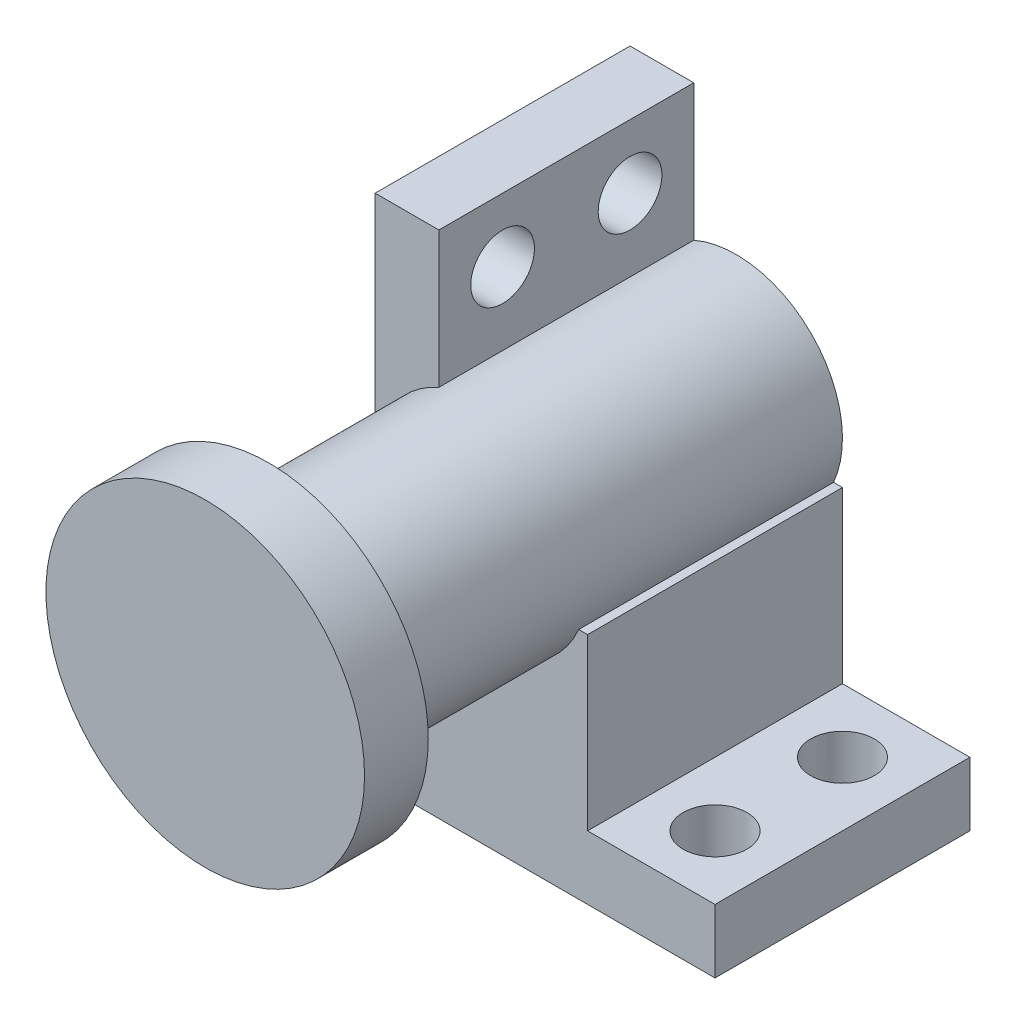
ISO-10303-21;
HEADER;
FILE_DESCRIPTION(('STEP AP214'),'2;1');
FILE_NAME('part.step','',(''),(''),'','','');
FILE_SCHEMA(('AUTOMOTIVE_DESIGN { 1 0 10303 214 1 1 1 1 }'));
ENDSEC;
DATA;
#1=APPLICATION_CONTEXT('core data for automotive mechanical design processes');
#2=APPLICATION_PROTOCOL_DEFINITION('international standard','automotive_design',2000,#1);
#3=PRODUCT_CONTEXT('',#1,'mechanical');
#4=PRODUCT('Part','Part','',(#3));
#5=PRODUCT_RELATED_PRODUCT_CATEGORY('part','',(#4));
#6=PRODUCT_DEFINITION_FORMATION('','',#4);
#7=PRODUCT_DEFINITION_CONTEXT('part definition',#1,'design');
#8=PRODUCT_DEFINITION('design','',#6,#7);
#9=PRODUCT_DEFINITION_SHAPE('','',#8);
#10=(LENGTH_UNIT() NAMED_UNIT(*) SI_UNIT(.MILLI.,.METRE.));
#11=(NAMED_UNIT(*) PLANE_ANGLE_UNIT() SI_UNIT($,.RADIAN.));
#12=(NAMED_UNIT(*) SI_UNIT($,.STERADIAN.) SOLID_ANGLE_UNIT());
#13=UNCERTAINTY_MEASURE_WITH_UNIT(LENGTH_MEASURE(1.E-05),#10,'distance_accuracy_value','');
#14=(GEOMETRIC_REPRESENTATION_CONTEXT(3) GLOBAL_UNCERTAINTY_ASSIGNED_CONTEXT((#13)) GLOBAL_UNIT_ASSIGNED_CONTEXT((#10,
#11,#12)) REPRESENTATION_CONTEXT('',''));
#15=CARTESIAN_POINT('',(0.,0.,0.));
#16=DIRECTION('',(0.,0.,1.));
#17=DIRECTION('',(1.,0.,0.));
#18=AXIS2_PLACEMENT_3D('',#15,#16,#17);
#19=CARTESIAN_POINT('',(11.,0.,12.));
#20=DIRECTION('',(-1.,0.,0.));
#21=DIRECTION('',(0.,0.,1.));
#22=AXIS2_PLACEMENT_3D('',#19,#20,#21);
#23=PLANE('',#22);
#24=DIRECTION('',(0.,0.,-1.));
#25=VECTOR('',#24,1.);
#26=CARTESIAN_POINT('',(11.,-10.,0.));
#27=LINE('',#26,#25);
#28=CARTESIAN_POINT('',(11.,-10.,12.));
#29=VERTEX_POINT('',#28);
#30=CARTESIAN_POINT('',(11.,-10.,0.));
#31=VERTEX_POINT('',#30);
#32=EDGE_CURVE('E60',#29,#31,#27,.T.);
#33=ORIENTED_EDGE('',*,*,#32,.F.);
#34=DIRECTION('',(0.,1.,0.));
#35=VECTOR('',#34,1.);
#36=CARTESIAN_POINT('',(11.,0.,12.));
#37=LINE('',#36,#35);
#38=CARTESIAN_POINT('',(11.,-13.,12.));
#39=VERTEX_POINT('',#38);
#40=EDGE_CURVE('E140',#39,#29,#37,.T.);
#41=ORIENTED_EDGE('',*,*,#40,.F.);
#42=DIRECTION('',(0.,0.,-1.));
#43=VECTOR('',#42,1.);
#44=CARTESIAN_POINT('',(11.,-13.,12.));
#45=LINE('',#44,#43);
#46=CARTESIAN_POINT('',(11.,-13.,0.));
#47=VERTEX_POINT('',#46);
#48=EDGE_CURVE('E51',#39,#47,#45,.T.);
#49=ORIENTED_EDGE('',*,*,#48,.T.);
#50=DIRECTION('',(0.,1.,0.));
#51=VECTOR('',#50,1.);
#52=CARTESIAN_POINT('',(11.,0.,0.));
#53=LINE('',#52,#51);
#54=EDGE_CURVE('E221',#47,#31,#53,.T.);
#55=ORIENTED_EDGE('',*,*,#54,.T.);
#56=EDGE_LOOP('',(#33,#41,#49,#55));
#57=FACE_BOUND('',#56,.T.);
#58=ADVANCED_FACE('F41',(#57),#23,.F.);
#59=CARTESIAN_POINT('',(8.,-13.,9.));
#60=DIRECTION('',(0.,1.,0.));
#61=DIRECTION('',(0.,0.,1.));
#62=AXIS2_PLACEMENT_3D('',#59,#60,#61);
#63=CYLINDRICAL_SURFACE('',#62,1.5);
#64=CARTESIAN_POINT('',(8.,-13.,9.));
#65=DIRECTION('',(0.,1.,0.));
#66=DIRECTION('',(0.,0.,1.));
#67=AXIS2_PLACEMENT_3D('',#64,#65,#66);
#68=CIRCLE('',#67,1.5);
#69=CARTESIAN_POINT('',(8.,-13.,10.5));
#70=VERTEX_POINT('',#69);
#71=EDGE_CURVE('E156',#70,#70,#68,.T.);
#72=ORIENTED_EDGE('',*,*,#71,.F.);
#73=EDGE_LOOP('',(#72));
#74=FACE_BOUND('',#73,.T.);
#75=CARTESIAN_POINT('',(8.,-10.,9.));
#76=DIRECTION('',(0.,1.,0.));
#77=DIRECTION('',(-1.,0.,0.));
#78=AXIS2_PLACEMENT_3D('',#75,#76,#77);
#79=CIRCLE('',#78,1.5);
#80=CARTESIAN_POINT('',(6.5,-10.,9.));
#81=VERTEX_POINT('',#80);
#82=EDGE_CURVE('E152',#81,#81,#79,.F.);
#83=ORIENTED_EDGE('',*,*,#82,.F.);
#84=EDGE_LOOP('',(#83));
#85=FACE_BOUND('',#84,.T.);
#86=ADVANCED_FACE('F296',(#74,#85),#63,.F.);
#87=CARTESIAN_POINT('',(8.,-13.,3.));
#88=DIRECTION('',(0.,1.,0.));
#89=DIRECTION('',(0.,0.,1.));
#90=AXIS2_PLACEMENT_3D('',#87,#88,#89);
#91=CYLINDRICAL_SURFACE('',#90,1.5);
#92=CARTESIAN_POINT('',(8.,-13.,3.));
#93=DIRECTION('',(0.,1.,0.));
#94=DIRECTION('',(0.,0.,1.));
#95=AXIS2_PLACEMENT_3D('',#92,#93,#94);
#96=CIRCLE('',#95,1.5);
#97=CARTESIAN_POINT('',(8.,-13.,4.5));
#98=VERTEX_POINT('',#97);
#99=EDGE_CURVE('E157',#98,#98,#96,.T.);
#100=ORIENTED_EDGE('',*,*,#99,.F.);
#101=EDGE_LOOP('',(#100));
#102=FACE_BOUND('',#101,.T.);
#103=CARTESIAN_POINT('',(8.,-10.,3.));
#104=DIRECTION('',(0.,1.,0.));
#105=DIRECTION('',(-1.,0.,0.));
#106=AXIS2_PLACEMENT_3D('',#103,#104,#105);
#107=CIRCLE('',#106,1.5);
#108=CARTESIAN_POINT('',(6.5,-10.,3.));
#109=VERTEX_POINT('',#108);
#110=EDGE_CURVE('E45',#109,#109,#107,.F.);
#111=ORIENTED_EDGE('',*,*,#110,.F.);
#112=EDGE_LOOP('',(#111));
#113=FACE_BOUND('',#112,.T.);
#114=ADVANCED_FACE('F294',(#102,#113),#91,.F.);
#115=CARTESIAN_POINT('',(0.,0.,12.));
#116=DIRECTION('',(0.,0.,1.));
#117=DIRECTION('',(1.,0.,0.));
#118=AXIS2_PLACEMENT_3D('',#115,#116,#117);
#119=PLANE('',#118);
#120=CARTESIAN_POINT('',(0.,0.,12.));
#121=DIRECTION('',(0.,0.,1.));
#122=DIRECTION('',(1.,0.,0.));
#123=AXIS2_PLACEMENT_3D('',#120,#121,#122);
#124=CIRCLE('',#123,5.);
#125=CARTESIAN_POINT('',(-2.,4.58257569495584,12.));
#126=VERTEX_POINT('',#125);
#127=CARTESIAN_POINT('',(-5.,0.,12.));
#128=VERTEX_POINT('',#127);
#129=EDGE_CURVE('E53',#126,#128,#124,.T.);
#130=ORIENTED_EDGE('',*,*,#129,.F.);
#131=DIRECTION('',(0.,-1.,0.));
#132=VECTOR('',#131,1.);
#133=CARTESIAN_POINT('',(-2.,0.,12.));
#134=LINE('',#133,#132);
#135=CARTESIAN_POINT('',(-2.,11.,12.));
#136=VERTEX_POINT('',#135);
#137=EDGE_CURVE('E205',#136,#126,#134,.T.);
#138=ORIENTED_EDGE('',*,*,#137,.F.);
#139=DIRECTION('',(1.,0.,0.));
#140=VECTOR('',#139,1.);
#141=CARTESIAN_POINT('',(0.,11.,12.));
#142=LINE('',#141,#140);
#143=CARTESIAN_POINT('',(-5.,11.,12.));
#144=VERTEX_POINT('',#143);
#145=EDGE_CURVE('E208',#144,#136,#142,.T.);
#146=ORIENTED_EDGE('',*,*,#145,.F.);
#147=DIRECTION('',(0.,1.,0.));
#148=VECTOR('',#147,1.);
#149=CARTESIAN_POINT('',(-5.,0.,12.));
#150=LINE('',#149,#148);
#151=EDGE_CURVE('E212',#128,#144,#150,.T.);
#152=ORIENTED_EDGE('',*,*,#151,.F.);
#153=EDGE_LOOP('',(#130,#138,#146,#152));
#154=FACE_BOUND('',#153,.T.);
#155=ADVANCED_FACE('F287',(#154),#119,.T.);
#156=CARTESIAN_POINT('',(0.,-13.,12.));
#157=DIRECTION('',(0.,-1.,0.));
#158=DIRECTION('',(1.,0.,0.));
#159=AXIS2_PLACEMENT_3D('',#156,#157,#158);
#160=PLANE('',#159);
#161=ORIENTED_EDGE('',*,*,#99,.T.);
#162=EDGE_LOOP('',(#161));
#163=FACE_BOUND('',#162,.T.);
#164=ORIENTED_EDGE('',*,*,#71,.T.);
#165=EDGE_LOOP('',(#164));
#166=FACE_BOUND('',#165,.T.);
#167=DIRECTION('',(-1.,0.,0.));
#168=VECTOR('',#167,1.);
#169=CARTESIAN_POINT('',(0.,-13.,0.));
#170=LINE('',#169,#168);
#171=CARTESIAN_POINT('',(-5.,-13.,0.));
#172=VERTEX_POINT('',#171);
#173=EDGE_CURVE('E191',#47,#172,#170,.T.);
#174=ORIENTED_EDGE('',*,*,#173,.F.);
#175=ORIENTED_EDGE('',*,*,#48,.F.);
#176=DIRECTION('',(-1.,0.,0.));
#177=VECTOR('',#176,1.);
#178=CARTESIAN_POINT('',(0.,-13.,12.));
#179=LINE('',#178,#177);
#180=CARTESIAN_POINT('',(-5.,-13.,12.));
#181=VERTEX_POINT('',#180);
#182=EDGE_CURVE('E195',#39,#181,#179,.T.);
#183=ORIENTED_EDGE('',*,*,#182,.T.);
#184=DIRECTION('',(0.,0.,-1.));
#185=VECTOR('',#184,1.);
#186=CARTESIAN_POINT('',(-5.,-13.,12.));
#187=LINE('',#186,#185);
#188=EDGE_CURVE('E217',#181,#172,#187,.T.);
#189=ORIENTED_EDGE('',*,*,#188,.T.);
#190=EDGE_LOOP('',(#174,#175,#183,#189));
#191=FACE_BOUND('',#190,.T.);
#192=ADVANCED_FACE('F43',(#163,#166,#191),#160,.T.);
#193=CARTESIAN_POINT('',(0.,-2.,12.));
#194=DIRECTION('',(0.,-1.,0.));
#195=DIRECTION('',(1.,0.,0.));
#196=AXIS2_PLACEMENT_3D('',#193,#194,#195);
#197=PLANE('',#196);
#198=DIRECTION('',(-1.,0.,0.));
#199=VECTOR('',#198,1.);
#200=CARTESIAN_POINT('',(0.,-2.,12.));
#201=LINE('',#200,#199);
#202=CARTESIAN_POINT('',(5.,-2.,12.));
#203=VERTEX_POINT('',#202);
#204=CARTESIAN_POINT('',(4.58257569495584,-2.,12.));
#205=VERTEX_POINT('',#204);
#206=EDGE_CURVE('E202',#203,#205,#201,.T.);
#207=ORIENTED_EDGE('',*,*,#206,.F.);
#208=DIRECTION('',(0.,0.,1.));
#209=VECTOR('',#208,1.);
#210=CARTESIAN_POINT('',(5.,-2.,0.));
#211=LINE('',#210,#209);
#212=CARTESIAN_POINT('',(5.,-2.,0.));
#213=VERTEX_POINT('',#212);
#214=EDGE_CURVE('E123',#213,#203,#211,.T.);
#215=ORIENTED_EDGE('',*,*,#214,.F.);
#216=DIRECTION('',(-1.,0.,0.));
#217=VECTOR('',#216,1.);
#218=CARTESIAN_POINT('',(0.,-2.,0.));
#219=LINE('',#218,#217);
#220=CARTESIAN_POINT('',(4.58257569495584,-2.,0.));
#221=VERTEX_POINT('',#220);
#222=EDGE_CURVE('E225',#213,#221,#219,.T.);
#223=ORIENTED_EDGE('',*,*,#222,.T.);
#224=DIRECTION('',(0.,0.,-1.));
#225=VECTOR('',#224,1.);
#226=CARTESIAN_POINT('',(4.58257569495584,-2.,12.));
#227=LINE('',#226,#225);
#228=EDGE_CURVE('E254',#205,#221,#227,.T.);
#229=ORIENTED_EDGE('',*,*,#228,.F.);
#230=EDGE_LOOP('',(#207,#215,#223,#229));
#231=FACE_BOUND('',#230,.T.);
#232=ADVANCED_FACE('F285',(#231),#197,.F.);
#233=CARTESIAN_POINT('',(0.,0.,12.));
#234=DIRECTION('',(0.,0.,-1.));
#235=DIRECTION('',(-1.,0.,0.));
#236=AXIS2_PLACEMENT_3D('',#233,#234,#235);
#237=CYLINDRICAL_SURFACE('',#236,5.);
#238=CARTESIAN_POINT('',(0.,0.,0.));
#239=DIRECTION('',(0.,0.,1.));
#240=DIRECTION('',(1.,0.,0.));
#241=AXIS2_PLACEMENT_3D('',#238,#239,#240);
#242=CIRCLE('',#241,5.);
#243=CARTESIAN_POINT('',(-2.,4.58257569495584,0.));
#244=VERTEX_POINT('',#243);
#245=EDGE_CURVE('E228',#221,#244,#242,.T.);
#246=ORIENTED_EDGE('',*,*,#245,.T.);
#247=DIRECTION('',(0.,0.,-1.));
#248=VECTOR('',#247,1.);
#249=CARTESIAN_POINT('',(-2.,4.58257569495584,12.));
#250=LINE('',#249,#248);
#251=EDGE_CURVE('E251',#126,#244,#250,.T.);
#252=ORIENTED_EDGE('',*,*,#251,.F.);
#253=ORIENTED_EDGE('',*,*,#129,.T.);
#254=EDGE_CURVE('E11',#128,#205,#124,.T.);
#255=ORIENTED_EDGE('',*,*,#254,.T.);
#256=ORIENTED_EDGE('',*,*,#228,.T.);
#257=EDGE_LOOP('',(#246,#252,#253,#255,#256));
#258=FACE_BOUND('',#257,.T.);
#259=CARTESIAN_POINT('',(0.,0.,22.));
#260=DIRECTION('',(0.,0.,1.));
#261=DIRECTION('',(1.,0.,0.));
#262=AXIS2_PLACEMENT_3D('',#259,#260,#261);
#263=CIRCLE('',#262,5.);
#264=CARTESIAN_POINT('',(5.,0.,22.));
#265=VERTEX_POINT('',#264);
#266=EDGE_CURVE('E188',#265,#265,#263,.T.);
#267=ORIENTED_EDGE('',*,*,#266,.F.);
#268=EDGE_LOOP('',(#267));
#269=FACE_BOUND('',#268,.T.);
#270=ADVANCED_FACE('F281',(#258,#269),#237,.T.);
#271=CARTESIAN_POINT('',(-2.,0.,12.));
#272=DIRECTION('',(1.,0.,0.));
#273=DIRECTION('',(0.,1.,0.));
#274=AXIS2_PLACEMENT_3D('',#271,#272,#273);
#275=PLANE('',#274);
#276=CARTESIAN_POINT('',(-2.,7.99853829447893,9.));
#277=DIRECTION('',(1.,0.,0.));
#278=DIRECTION('',(0.,1.,0.));
#279=AXIS2_PLACEMENT_3D('',#276,#277,#278);
#280=CIRCLE('',#279,1.5);
#281=CARTESIAN_POINT('',(-2.,9.49853829447893,9.));
#282=VERTEX_POINT('',#281);
#283=EDGE_CURVE('E170',#282,#282,#280,.T.);
#284=ORIENTED_EDGE('',*,*,#283,.F.);
#285=EDGE_LOOP('',(#284));
#286=FACE_BOUND('',#285,.T.);
#287=CARTESIAN_POINT('',(-2.,7.99853829447893,3.));
#288=DIRECTION('',(1.,0.,0.));
#289=DIRECTION('',(0.,1.,0.));
#290=AXIS2_PLACEMENT_3D('',#287,#288,#289);
#291=CIRCLE('',#290,1.5);
#292=CARTESIAN_POINT('',(-2.,9.49853829447893,3.));
#293=VERTEX_POINT('',#292);
#294=EDGE_CURVE('E161',#293,#293,#291,.T.);
#295=ORIENTED_EDGE('',*,*,#294,.F.);
#296=EDGE_LOOP('',(#295));
#297=FACE_BOUND('',#296,.T.);
#298=DIRECTION('',(0.,-1.,0.));
#299=VECTOR('',#298,1.);
#300=CARTESIAN_POINT('',(-2.,0.,0.));
#301=LINE('',#300,#299);
#302=CARTESIAN_POINT('',(-2.,11.,0.));
#303=VERTEX_POINT('',#302);
#304=EDGE_CURVE('E232',#303,#244,#301,.T.);
#305=ORIENTED_EDGE('',*,*,#304,.F.);
#306=DIRECTION('',(0.,0.,-1.));
#307=VECTOR('',#306,1.);
#308=CARTESIAN_POINT('',(-2.,11.,12.));
#309=LINE('',#308,#307);
#310=EDGE_CURVE('E248',#136,#303,#309,.T.);
#311=ORIENTED_EDGE('',*,*,#310,.F.);
#312=ORIENTED_EDGE('',*,*,#137,.T.);
#313=ORIENTED_EDGE('',*,*,#251,.T.);
#314=EDGE_LOOP('',(#305,#311,#312,#313));
#315=FACE_BOUND('',#314,.T.);
#316=ADVANCED_FACE('F277',(#286,#297,#315),#275,.T.);
#317=CARTESIAN_POINT('',(0.,11.,12.));
#318=DIRECTION('',(0.,1.,0.));
#319=DIRECTION('',(0.,0.,1.));
#320=AXIS2_PLACEMENT_3D('',#317,#318,#319);
#321=PLANE('',#320);
#322=DIRECTION('',(1.,0.,0.));
#323=VECTOR('',#322,1.);
#324=CARTESIAN_POINT('',(0.,11.,0.));
#325=LINE('',#324,#323);
#326=CARTESIAN_POINT('',(-5.,11.,0.));
#327=VERTEX_POINT('',#326);
#328=EDGE_CURVE('E236',#327,#303,#325,.T.);
#329=ORIENTED_EDGE('',*,*,#328,.F.);
#330=DIRECTION('',(0.,0.,-1.));
#331=VECTOR('',#330,1.);
#332=CARTESIAN_POINT('',(-5.,11.,12.));
#333=LINE('',#332,#331);
#334=EDGE_CURVE('E245',#144,#327,#333,.T.);
#335=ORIENTED_EDGE('',*,*,#334,.F.);
#336=ORIENTED_EDGE('',*,*,#145,.T.);
#337=ORIENTED_EDGE('',*,*,#310,.T.);
#338=EDGE_LOOP('',(#329,#335,#336,#337));
#339=FACE_BOUND('',#338,.T.);
#340=ADVANCED_FACE('F273',(#339),#321,.T.);
#341=CARTESIAN_POINT('',(-5.,0.,12.));
#342=DIRECTION('',(-1.,0.,0.));
#343=DIRECTION('',(0.,0.,1.));
#344=AXIS2_PLACEMENT_3D('',#341,#342,#343);
#345=PLANE('',#344);
#346=CARTESIAN_POINT('',(-5.,7.99853829447893,9.));
#347=DIRECTION('',(1.,0.,0.));
#348=DIRECTION('',(0.,1.,0.));
#349=AXIS2_PLACEMENT_3D('',#346,#347,#348);
#350=CIRCLE('',#349,1.5);
#351=CARTESIAN_POINT('',(-5.,9.49853829447893,9.));
#352=VERTEX_POINT('',#351);
#353=EDGE_CURVE('E165',#352,#352,#350,.T.);
#354=ORIENTED_EDGE('',*,*,#353,.T.);
#355=EDGE_LOOP('',(#354));
#356=FACE_BOUND('',#355,.T.);
#357=CARTESIAN_POINT('',(-5.,7.99853829447893,3.));
#358=DIRECTION('',(1.,0.,0.));
#359=DIRECTION('',(0.,1.,0.));
#360=AXIS2_PLACEMENT_3D('',#357,#358,#359);
#361=CIRCLE('',#360,1.5);
#362=CARTESIAN_POINT('',(-5.,9.49853829447893,3.));
#363=VERTEX_POINT('',#362);
#364=EDGE_CURVE('E174',#363,#363,#361,.T.);
#365=ORIENTED_EDGE('',*,*,#364,.T.);
#366=EDGE_LOOP('',(#365));
#367=FACE_BOUND('',#366,.T.);
#368=DIRECTION('',(0.,1.,0.));
#369=VECTOR('',#368,1.);
#370=CARTESIAN_POINT('',(-5.,0.,0.));
#371=LINE('',#370,#369);
#372=EDGE_CURVE('E199',#172,#327,#371,.T.);
#373=ORIENTED_EDGE('',*,*,#372,.F.);
#374=ORIENTED_EDGE('',*,*,#188,.F.);
#375=EDGE_CURVE('E213',#181,#128,#150,.T.);
#376=ORIENTED_EDGE('',*,*,#375,.T.);
#377=ORIENTED_EDGE('',*,*,#151,.T.);
#378=ORIENTED_EDGE('',*,*,#334,.T.);
#379=EDGE_LOOP('',(#373,#374,#376,#377,#378));
#380=FACE_BOUND('',#379,.T.);
#381=ADVANCED_FACE('F267',(#356,#367,#380),#345,.T.);
#382=DIRECTION('',(0.,1.,0.));
#383=VECTOR('',#382,1.);
#384=CARTESIAN_POINT('',(5.,-10.,12.));
#385=LINE('',#384,#383);
#386=CARTESIAN_POINT('',(5.,-10.,12.));
#387=VERTEX_POINT('',#386);
#388=EDGE_CURVE('E118',#387,#203,#385,.T.);
#389=ORIENTED_EDGE('',*,*,#388,.T.);
#390=ORIENTED_EDGE('',*,*,#206,.T.);
#391=ORIENTED_EDGE('',*,*,#254,.F.);
#392=ORIENTED_EDGE('',*,*,#375,.F.);
#393=ORIENTED_EDGE('',*,*,#182,.F.);
#394=ORIENTED_EDGE('',*,*,#40,.T.);
#395=DIRECTION('',(1.,0.,0.));
#396=VECTOR('',#395,1.);
#397=CARTESIAN_POINT('',(5.,-10.,12.));
#398=LINE('',#397,#396);
#399=EDGE_CURVE('E132',#387,#29,#398,.T.);
#400=ORIENTED_EDGE('',*,*,#399,.F.);
#401=EDGE_LOOP('',(#389,#390,#391,#392,#393,#394,#400));
#402=FACE_BOUND('',#401,.T.);
#403=ADVANCED_FACE('F137',(#402),#119,.T.);
#404=CARTESIAN_POINT('',(0.,0.,0.));
#405=DIRECTION('',(0.,0.,1.));
#406=DIRECTION('',(1.,0.,0.));
#407=AXIS2_PLACEMENT_3D('',#404,#405,#406);
#408=PLANE('',#407);
#409=ORIENTED_EDGE('',*,*,#222,.F.);
#410=DIRECTION('',(0.,1.,0.));
#411=VECTOR('',#410,1.);
#412=CARTESIAN_POINT('',(5.,-10.,0.));
#413=LINE('',#412,#411);
#414=CARTESIAN_POINT('',(5.,-10.,0.));
#415=VERTEX_POINT('',#414);
#416=EDGE_CURVE('E127',#415,#213,#413,.T.);
#417=ORIENTED_EDGE('',*,*,#416,.F.);
#418=DIRECTION('',(-1.,0.,0.));
#419=VECTOR('',#418,1.);
#420=CARTESIAN_POINT('',(5.,-10.,0.));
#421=LINE('',#420,#419);
#422=EDGE_CURVE('E128',#31,#415,#421,.T.);
#423=ORIENTED_EDGE('',*,*,#422,.F.);
#424=ORIENTED_EDGE('',*,*,#54,.F.);
#425=ORIENTED_EDGE('',*,*,#173,.T.);
#426=ORIENTED_EDGE('',*,*,#372,.T.);
#427=ORIENTED_EDGE('',*,*,#328,.T.);
#428=ORIENTED_EDGE('',*,*,#304,.T.);
#429=ORIENTED_EDGE('',*,*,#245,.F.);
#430=EDGE_LOOP('',(#409,#417,#423,#424,#425,#426,#427,#428,#429));
#431=FACE_BOUND('',#430,.T.);
#432=ADVANCED_FACE('F264',(#431),#408,.F.);
#433=CARTESIAN_POINT('',(0.,0.,25.));
#434=DIRECTION('',(0.,0.,-1.));
#435=DIRECTION('',(-1.,0.,0.));
#436=AXIS2_PLACEMENT_3D('',#433,#434,#435);
#437=CYLINDRICAL_SURFACE('',#436,7.5);
#438=CARTESIAN_POINT('',(0.,0.,25.));
#439=DIRECTION('',(0.,0.,1.));
#440=DIRECTION('',(1.,0.,0.));
#441=AXIS2_PLACEMENT_3D('',#438,#439,#440);
#442=CIRCLE('',#441,7.5);
#443=CARTESIAN_POINT('',(7.5,0.,25.));
#444=VERTEX_POINT('',#443);
#445=EDGE_CURVE('E181',#444,#444,#442,.T.);
#446=ORIENTED_EDGE('',*,*,#445,.F.);
#447=EDGE_LOOP('',(#446));
#448=FACE_BOUND('',#447,.T.);
#449=CARTESIAN_POINT('',(0.,0.,22.));
#450=DIRECTION('',(0.,0.,1.));
#451=DIRECTION('',(1.,0.,0.));
#452=AXIS2_PLACEMENT_3D('',#449,#450,#451);
#453=CIRCLE('',#452,7.5);
#454=CARTESIAN_POINT('',(7.5,0.,22.));
#455=VERTEX_POINT('',#454);
#456=EDGE_CURVE('E169',#455,#455,#453,.T.);
#457=ORIENTED_EDGE('',*,*,#456,.T.);
#458=EDGE_LOOP('',(#457));
#459=FACE_BOUND('',#458,.T.);
#460=ADVANCED_FACE('F325',(#448,#459),#437,.T.);
#461=CARTESIAN_POINT('',(0.,0.,25.));
#462=DIRECTION('',(0.,0.,1.));
#463=DIRECTION('',(1.,0.,0.));
#464=AXIS2_PLACEMENT_3D('',#461,#462,#463);
#465=PLANE('',#464);
#466=ORIENTED_EDGE('',*,*,#445,.T.);
#467=EDGE_LOOP('',(#466));
#468=FACE_BOUND('',#467,.T.);
#469=ADVANCED_FACE('F330',(#468),#465,.T.);
#470=CARTESIAN_POINT('',(0.,0.,22.));
#471=DIRECTION('',(0.,0.,1.));
#472=DIRECTION('',(1.,0.,0.));
#473=AXIS2_PLACEMENT_3D('',#470,#471,#472);
#474=PLANE('',#473);
#475=ORIENTED_EDGE('',*,*,#266,.T.);
#476=EDGE_LOOP('',(#475));
#477=FACE_BOUND('',#476,.T.);
#478=ORIENTED_EDGE('',*,*,#456,.F.);
#479=EDGE_LOOP('',(#478));
#480=FACE_BOUND('',#479,.T.);
#481=ADVANCED_FACE('F332',(#477,#480),#474,.F.);
#482=CARTESIAN_POINT('',(-5.,7.99853829447893,3.));
#483=DIRECTION('',(1.,0.,0.));
#484=DIRECTION('',(0.,1.,0.));
#485=AXIS2_PLACEMENT_3D('',#482,#483,#484);
#486=CYLINDRICAL_SURFACE('',#485,1.5);
#487=ORIENTED_EDGE('',*,*,#364,.F.);
#488=EDGE_LOOP('',(#487));
#489=FACE_BOUND('',#488,.T.);
#490=ORIENTED_EDGE('',*,*,#294,.T.);
#491=EDGE_LOOP('',(#490));
#492=FACE_BOUND('',#491,.T.);
#493=ADVANCED_FACE('F335',(#489,#492),#486,.F.);
#494=CARTESIAN_POINT('',(-5.,7.99853829447893,9.));
#495=DIRECTION('',(1.,0.,0.));
#496=DIRECTION('',(0.,1.,0.));
#497=AXIS2_PLACEMENT_3D('',#494,#495,#496);
#498=CYLINDRICAL_SURFACE('',#497,1.5);
#499=ORIENTED_EDGE('',*,*,#353,.F.);
#500=EDGE_LOOP('',(#499));
#501=FACE_BOUND('',#500,.T.);
#502=ORIENTED_EDGE('',*,*,#283,.T.);
#503=EDGE_LOOP('',(#502));
#504=FACE_BOUND('',#503,.T.);
#505=ADVANCED_FACE('F342',(#501,#504),#498,.F.);
#506=CARTESIAN_POINT('',(0.,-10.,0.));
#507=DIRECTION('',(0.,1.,0.));
#508=DIRECTION('',(-1.,0.,0.));
#509=AXIS2_PLACEMENT_3D('',#506,#507,#508);
#510=PLANE('',#509);
#511=DIRECTION('',(0.,0.,1.));
#512=VECTOR('',#511,1.);
#513=CARTESIAN_POINT('',(5.,-10.,0.));
#514=LINE('',#513,#512);
#515=EDGE_CURVE('E121',#415,#387,#514,.T.);
#516=ORIENTED_EDGE('',*,*,#515,.T.);
#517=ORIENTED_EDGE('',*,*,#399,.T.);
#518=ORIENTED_EDGE('',*,*,#32,.T.);
#519=ORIENTED_EDGE('',*,*,#422,.T.);
#520=EDGE_LOOP('',(#516,#517,#518,#519));
#521=FACE_BOUND('',#520,.T.);
#522=ORIENTED_EDGE('',*,*,#110,.T.);
#523=EDGE_LOOP('',(#522));
#524=FACE_BOUND('',#523,.T.);
#525=ORIENTED_EDGE('',*,*,#82,.T.);
#526=EDGE_LOOP('',(#525));
#527=FACE_BOUND('',#526,.T.);
#528=ADVANCED_FACE('F130',(#521,#524,#527),#510,.T.);
#529=CARTESIAN_POINT('',(5.,-10.,0.));
#530=DIRECTION('',(-1.,0.,0.));
#531=DIRECTION('',(0.,-1.,0.));
#532=AXIS2_PLACEMENT_3D('',#529,#530,#531);
#533=PLANE('',#532);
#534=ORIENTED_EDGE('',*,*,#214,.T.);
#535=ORIENTED_EDGE('',*,*,#388,.F.);
#536=ORIENTED_EDGE('',*,*,#515,.F.);
#537=ORIENTED_EDGE('',*,*,#416,.T.);
#538=EDGE_LOOP('',(#534,#535,#536,#537));
#539=FACE_BOUND('',#538,.T.);
#540=ADVANCED_FACE('F120',(#539),#533,.F.);
#541=CLOSED_SHELL('',(#58,#86,#114,#155,#192,#232,#270,#316,#340,#381,#403,#432,#460,#469,#481,
#493,#505,#528,#540));
#542=MANIFOLD_SOLID_BREP('B2',#541);
#543=ADVANCED_BREP_SHAPE_REPRESENTATION('',(#18,#542),#14);
#544=SHAPE_DEFINITION_REPRESENTATION(#9,#543);
ENDSEC;
END-ISO-10303-21;
